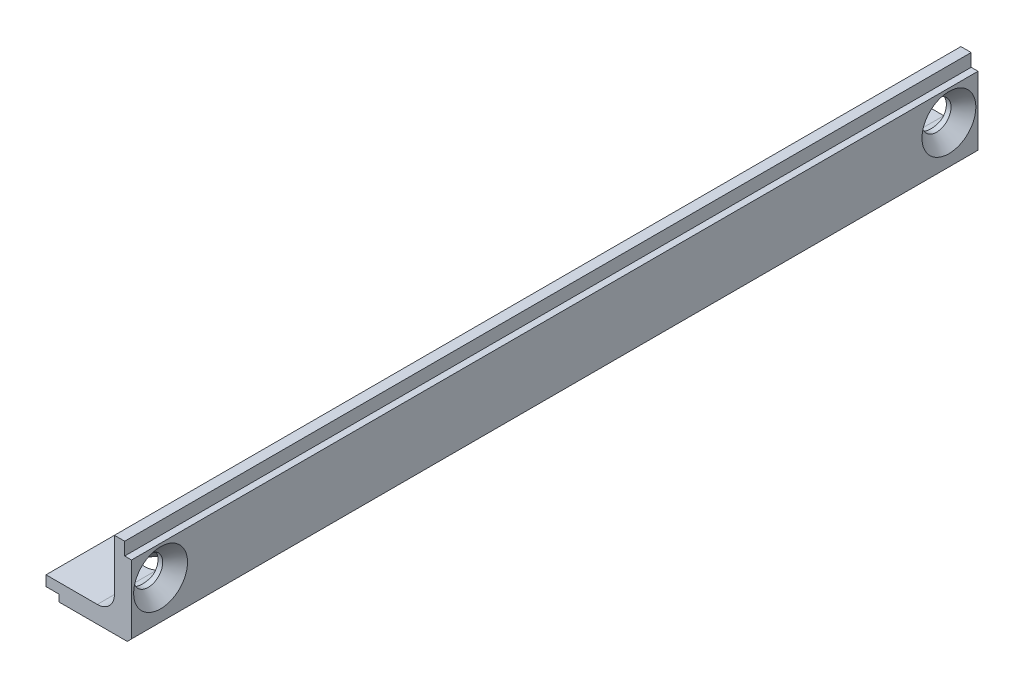
ISO-10303-21;
HEADER;
FILE_DESCRIPTION(('STEP AP214'),'2;1');
FILE_NAME('part.step','',(''),(''),'','','');
FILE_SCHEMA(('AUTOMOTIVE_DESIGN { 1 0 10303 214 1 1 1 1 }'));
ENDSEC;
DATA;
#1=APPLICATION_CONTEXT('core data for automotive mechanical design processes');
#2=APPLICATION_PROTOCOL_DEFINITION('international standard','automotive_design',2000,#1);
#3=PRODUCT_CONTEXT('',#1,'mechanical');
#4=PRODUCT('Part','Part','',(#3));
#5=PRODUCT_RELATED_PRODUCT_CATEGORY('part','',(#4));
#6=PRODUCT_DEFINITION_FORMATION('','',#4);
#7=PRODUCT_DEFINITION_CONTEXT('part definition',#1,'design');
#8=PRODUCT_DEFINITION('design','',#6,#7);
#9=PRODUCT_DEFINITION_SHAPE('','',#8);
#10=(LENGTH_UNIT() NAMED_UNIT(*) SI_UNIT(.MILLI.,.METRE.));
#11=(NAMED_UNIT(*) PLANE_ANGLE_UNIT() SI_UNIT($,.RADIAN.));
#12=(NAMED_UNIT(*) SI_UNIT($,.STERADIAN.) SOLID_ANGLE_UNIT());
#13=UNCERTAINTY_MEASURE_WITH_UNIT(LENGTH_MEASURE(1.E-05),#10,'distance_accuracy_value','');
#14=(GEOMETRIC_REPRESENTATION_CONTEXT(3) GLOBAL_UNCERTAINTY_ASSIGNED_CONTEXT((#13)) GLOBAL_UNIT_ASSIGNED_CONTEXT((#10,
#11,#12)) REPRESENTATION_CONTEXT('',''));
#15=CARTESIAN_POINT('',(0.,0.,0.));
#16=DIRECTION('',(0.,0.,1.));
#17=DIRECTION('',(1.,0.,0.));
#18=AXIS2_PLACEMENT_3D('',#15,#16,#17);
#19=CARTESIAN_POINT('',(0.,1.,99.));
#20=DIRECTION('',(0.,-1.,0.));
#21=DIRECTION('',(0.,0.,-1.));
#22=AXIS2_PLACEMENT_3D('',#19,#20,#21);
#23=PLANE('',#22);
#24=DIRECTION('',(0.,0.,-1.));
#25=VECTOR('',#24,1.);
#26=CARTESIAN_POINT('',(-3.,1.,0.));
#27=LINE('',#26,#25);
#28=CARTESIAN_POINT('',(-3.,1.,99.));
#29=VERTEX_POINT('',#28);
#30=CARTESIAN_POINT('',(-3.,1.,92.0747727084867));
#31=VERTEX_POINT('',#30);
#32=EDGE_CURVE('E174',#29,#31,#27,.T.);
#33=ORIENTED_EDGE('',*,*,#32,.T.);
#34=CARTESIAN_POINT('',(-4.,1.,90.7));
#35=DIRECTION('',(0.,-1.,0.));
#36=DIRECTION('',(0.,0.,-1.));
#37=AXIS2_PLACEMENT_3D('',#34,#35,#36);
#38=CIRCLE('',#37,1.7);
#39=CARTESIAN_POINT('',(-3.,1.,89.3252272915133));
#40=VERTEX_POINT('',#39);
#41=EDGE_CURVE('E67',#31,#40,#38,.T.);
#42=ORIENTED_EDGE('',*,*,#41,.T.);
#43=CARTESIAN_POINT('',(-3.,1.,9.67477270848675));
#44=VERTEX_POINT('',#43);
#45=EDGE_CURVE('E178',#40,#44,#27,.T.);
#46=ORIENTED_EDGE('',*,*,#45,.T.);
#47=CARTESIAN_POINT('',(-4.,1.,8.30000000000001));
#48=DIRECTION('',(0.,-1.,0.));
#49=DIRECTION('',(0.,0.,-1.));
#50=AXIS2_PLACEMENT_3D('',#47,#48,#49);
#51=CIRCLE('',#50,1.7);
#52=CARTESIAN_POINT('',(-3.,1.,6.92522729151325));
#53=VERTEX_POINT('',#52);
#54=EDGE_CURVE('E335',#44,#53,#51,.T.);
#55=ORIENTED_EDGE('',*,*,#54,.T.);
#56=CARTESIAN_POINT('',(-3.,1.,0.));
#57=VERTEX_POINT('',#56);
#58=EDGE_CURVE('E180',#53,#57,#27,.T.);
#59=ORIENTED_EDGE('',*,*,#58,.T.);
#60=DIRECTION('',(-1.,0.,0.));
#61=VECTOR('',#60,1.);
#62=CARTESIAN_POINT('',(0.,1.,0.));
#63=LINE('',#62,#61);
#64=CARTESIAN_POINT('',(-9.,1.,0.));
#65=VERTEX_POINT('',#64);
#66=EDGE_CURVE('E301',#57,#65,#63,.T.);
#67=ORIENTED_EDGE('',*,*,#66,.T.);
#68=DIRECTION('',(0.,0.,-1.));
#69=VECTOR('',#68,1.);
#70=CARTESIAN_POINT('',(-9.,1.,99.));
#71=LINE('',#70,#69);
#72=CARTESIAN_POINT('',(-9.,1.,99.));
#73=VERTEX_POINT('',#72);
#74=EDGE_CURVE('E282',#73,#65,#71,.T.);
#75=ORIENTED_EDGE('',*,*,#74,.F.);
#76=DIRECTION('',(-1.,0.,0.));
#77=VECTOR('',#76,1.);
#78=CARTESIAN_POINT('',(0.,1.,99.));
#79=LINE('',#78,#77);
#80=EDGE_CURVE('E290',#29,#73,#79,.T.);
#81=ORIENTED_EDGE('',*,*,#80,.F.);
#82=EDGE_LOOP('',(#33,#42,#46,#55,#59,#67,#75,#81));
#83=FACE_BOUND('',#82,.T.);
#84=ADVANCED_FACE('F41',(#83),#23,.F.);
#85=CARTESIAN_POINT('',(-9.,-1.,99.));
#86=DIRECTION('',(-1.,0.,0.));
#87=DIRECTION('',(0.,0.,1.));
#88=AXIS2_PLACEMENT_3D('',#85,#86,#87);
#89=PLANE('',#88);
#90=DIRECTION('',(0.,0.,1.));
#91=VECTOR('',#90,1.);
#92=CARTESIAN_POINT('',(-9.,-0.2,0.));
#93=LINE('',#92,#91);
#94=CARTESIAN_POINT('',(-9.,-0.2,0.));
#95=VERTEX_POINT('',#94);
#96=CARTESIAN_POINT('',(-9.,-0.2,99.));
#97=VERTEX_POINT('',#96);
#98=EDGE_CURVE('E304',#95,#97,#93,.T.);
#99=ORIENTED_EDGE('',*,*,#98,.T.);
#100=DIRECTION('',(0.,1.,0.));
#101=VECTOR('',#100,1.);
#102=CARTESIAN_POINT('',(-9.,-1.,99.));
#103=LINE('',#102,#101);
#104=EDGE_CURVE('E314',#97,#73,#103,.T.);
#105=ORIENTED_EDGE('',*,*,#104,.T.);
#106=ORIENTED_EDGE('',*,*,#74,.T.);
#107=DIRECTION('',(0.,1.,0.));
#108=VECTOR('',#107,1.);
#109=CARTESIAN_POINT('',(-9.,-1.,0.));
#110=LINE('',#109,#108);
#111=EDGE_CURVE('E299',#95,#65,#110,.T.);
#112=ORIENTED_EDGE('',*,*,#111,.F.);
#113=EDGE_LOOP('',(#99,#105,#106,#112));
#114=FACE_BOUND('',#113,.T.);
#115=ADVANCED_FACE('F250',(#114),#89,.T.);
#116=CARTESIAN_POINT('',(0.,-1.,99.));
#117=DIRECTION('',(0.,-1.,0.));
#118=DIRECTION('',(0.,0.,-1.));
#119=AXIS2_PLACEMENT_3D('',#116,#117,#118);
#120=PLANE('',#119);
#121=CARTESIAN_POINT('',(-4.,-1.,90.7));
#122=DIRECTION('',(0.,-1.,0.));
#123=DIRECTION('',(0.,0.,-1.));
#124=AXIS2_PLACEMENT_3D('',#121,#122,#123);
#125=CIRCLE('',#124,3.15);
#126=CARTESIAN_POINT('',(-4.,-1.,87.55));
#127=VERTEX_POINT('',#126);
#128=EDGE_CURVE('E168',#127,#127,#125,.T.);
#129=ORIENTED_EDGE('',*,*,#128,.F.);
#130=EDGE_LOOP('',(#129));
#131=FACE_BOUND('',#130,.T.);
#132=CARTESIAN_POINT('',(-4.,-1.,8.30000000000001));
#133=DIRECTION('',(0.,-1.,0.));
#134=DIRECTION('',(0.,0.,-1.));
#135=AXIS2_PLACEMENT_3D('',#132,#133,#134);
#136=CIRCLE('',#135,3.15);
#137=CARTESIAN_POINT('',(-4.,-1.,5.15000000000001));
#138=VERTEX_POINT('',#137);
#139=EDGE_CURVE('E359',#138,#138,#136,.T.);
#140=ORIENTED_EDGE('',*,*,#139,.F.);
#141=EDGE_LOOP('',(#140));
#142=FACE_BOUND('',#141,.T.);
#143=DIRECTION('',(0.,0.,1.));
#144=VECTOR('',#143,1.);
#145=CARTESIAN_POINT('',(-7.5,-1.,0.));
#146=LINE('',#145,#144);
#147=CARTESIAN_POINT('',(-7.5,-1.,0.));
#148=VERTEX_POINT('',#147);
#149=CARTESIAN_POINT('',(-7.5,-1.,99.));
#150=VERTEX_POINT('',#149);
#151=EDGE_CURVE('E338',#148,#150,#146,.T.);
#152=ORIENTED_EDGE('',*,*,#151,.F.);
#153=DIRECTION('',(-1.,0.,0.));
#154=VECTOR('',#153,1.);
#155=CARTESIAN_POINT('',(0.,-1.,0.));
#156=LINE('',#155,#154);
#157=CARTESIAN_POINT('',(0.5,-1.,0.));
#158=VERTEX_POINT('',#157);
#159=EDGE_CURVE('E296',#158,#148,#156,.T.);
#160=ORIENTED_EDGE('',*,*,#159,.F.);
#161=DIRECTION('',(0.,0.,1.));
#162=VECTOR('',#161,1.);
#163=CARTESIAN_POINT('',(0.5,-1.,99.));
#164=LINE('',#163,#162);
#165=CARTESIAN_POINT('',(0.5,-1.,99.));
#166=VERTEX_POINT('',#165);
#167=EDGE_CURVE('E271',#158,#166,#164,.T.);
#168=ORIENTED_EDGE('',*,*,#167,.T.);
#169=DIRECTION('',(-1.,0.,0.));
#170=VECTOR('',#169,1.);
#171=CARTESIAN_POINT('',(0.,-1.,99.));
#172=LINE('',#171,#170);
#173=EDGE_CURVE('E311',#166,#150,#172,.T.);
#174=ORIENTED_EDGE('',*,*,#173,.T.);
#175=EDGE_LOOP('',(#152,#160,#168,#174));
#176=FACE_BOUND('',#175,.T.);
#177=ADVANCED_FACE('F246',(#131,#142,#176),#120,.T.);
#178=CARTESIAN_POINT('',(1.,9.,99.));
#179=DIRECTION('',(1.,0.,0.));
#180=DIRECTION('',(0.,0.,-1.));
#181=AXIS2_PLACEMENT_3D('',#178,#179,#180);
#182=PLANE('',#181);
#183=CARTESIAN_POINT('',(1.,3.99999999999981,95.6));
#184=DIRECTION('',(1.,0.,0.));
#185=DIRECTION('',(0.,0.,-1.));
#186=AXIS2_PLACEMENT_3D('',#183,#184,#185);
#187=CIRCLE('',#186,3.15);
#188=CARTESIAN_POINT('',(1.,3.99999999999981,92.45));
#189=VERTEX_POINT('',#188);
#190=EDGE_CURVE('E378',#189,#189,#187,.T.);
#191=ORIENTED_EDGE('',*,*,#190,.F.);
#192=EDGE_LOOP('',(#191));
#193=FACE_BOUND('',#192,.T.);
#194=CARTESIAN_POINT('',(1.,3.99999999999981,3.40000000000001));
#195=DIRECTION('',(1.,0.,0.));
#196=DIRECTION('',(0.,0.,-1.));
#197=AXIS2_PLACEMENT_3D('',#194,#195,#196);
#198=CIRCLE('',#197,3.15);
#199=CARTESIAN_POINT('',(1.,3.99999999999981,0.250000000000007));
#200=VERTEX_POINT('',#199);
#201=EDGE_CURVE('E367',#200,#200,#198,.T.);
#202=ORIENTED_EDGE('',*,*,#201,.F.);
#203=EDGE_LOOP('',(#202));
#204=FACE_BOUND('',#203,.T.);
#205=DIRECTION('',(0.,0.,1.));
#206=VECTOR('',#205,1.);
#207=CARTESIAN_POINT('',(1.,7.5,0.));
#208=LINE('',#207,#206);
#209=CARTESIAN_POINT('',(1.,7.5,0.));
#210=VERTEX_POINT('',#209);
#211=CARTESIAN_POINT('',(1.,7.5,99.));
#212=VERTEX_POINT('',#211);
#213=EDGE_CURVE('E331',#210,#212,#208,.T.);
#214=ORIENTED_EDGE('',*,*,#213,.T.);
#215=DIRECTION('',(0.,1.,0.));
#216=VECTOR('',#215,1.);
#217=CARTESIAN_POINT('',(1.,9.,99.));
#218=LINE('',#217,#216);
#219=CARTESIAN_POINT('',(1.,-0.500000000000013,99.));
#220=VERTEX_POINT('',#219);
#221=EDGE_CURVE('E309',#212,#220,#218,.F.);
#222=ORIENTED_EDGE('',*,*,#221,.T.);
#223=DIRECTION('',(0.,0.,-1.));
#224=VECTOR('',#223,1.);
#225=CARTESIAN_POINT('',(1.,-0.500000000000013,99.));
#226=LINE('',#225,#224);
#227=CARTESIAN_POINT('',(1.,-0.500000000000013,0.));
#228=VERTEX_POINT('',#227);
#229=EDGE_CURVE('E273',#220,#228,#226,.T.);
#230=ORIENTED_EDGE('',*,*,#229,.T.);
#231=DIRECTION('',(0.,1.,0.));
#232=VECTOR('',#231,1.);
#233=CARTESIAN_POINT('',(1.,9.,0.));
#234=LINE('',#233,#232);
#235=EDGE_CURVE('E294',#210,#228,#234,.F.);
#236=ORIENTED_EDGE('',*,*,#235,.F.);
#237=EDGE_LOOP('',(#214,#222,#230,#236));
#238=FACE_BOUND('',#237,.T.);
#239=ADVANCED_FACE('F242',(#193,#204,#238),#182,.T.);
#240=CARTESIAN_POINT('',(-1.,9.,99.));
#241=DIRECTION('',(0.,1.,0.));
#242=DIRECTION('',(0.,0.,1.));
#243=AXIS2_PLACEMENT_3D('',#240,#241,#242);
#244=PLANE('',#243);
#245=DIRECTION('',(0.,0.,1.));
#246=VECTOR('',#245,1.);
#247=CARTESIAN_POINT('',(0.2,9.,0.));
#248=LINE('',#247,#246);
#249=CARTESIAN_POINT('',(0.2,9.,0.));
#250=VERTEX_POINT('',#249);
#251=CARTESIAN_POINT('',(0.2,9.,99.));
#252=VERTEX_POINT('',#251);
#253=EDGE_CURVE('E325',#250,#252,#248,.T.);
#254=ORIENTED_EDGE('',*,*,#253,.F.);
#255=DIRECTION('',(1.,0.,0.));
#256=VECTOR('',#255,1.);
#257=CARTESIAN_POINT('',(-1.,9.,0.));
#258=LINE('',#257,#256);
#259=CARTESIAN_POINT('',(-1.,9.,0.));
#260=VERTEX_POINT('',#259);
#261=EDGE_CURVE('E291',#260,#250,#258,.T.);
#262=ORIENTED_EDGE('',*,*,#261,.F.);
#263=DIRECTION('',(0.,0.,-1.));
#264=VECTOR('',#263,1.);
#265=CARTESIAN_POINT('',(-1.,9.,99.));
#266=LINE('',#265,#264);
#267=CARTESIAN_POINT('',(-1.,9.,99.));
#268=VERTEX_POINT('',#267);
#269=EDGE_CURVE('E285',#268,#260,#266,.T.);
#270=ORIENTED_EDGE('',*,*,#269,.F.);
#271=DIRECTION('',(1.,0.,0.));
#272=VECTOR('',#271,1.);
#273=CARTESIAN_POINT('',(-1.,9.,99.));
#274=LINE('',#273,#272);
#275=EDGE_CURVE('E306',#268,#252,#274,.T.);
#276=ORIENTED_EDGE('',*,*,#275,.T.);
#277=EDGE_LOOP('',(#254,#262,#270,#276));
#278=FACE_BOUND('',#277,.T.);
#279=ADVANCED_FACE('F239',(#278),#244,.T.);
#280=CARTESIAN_POINT('',(-1.,9.,99.));
#281=DIRECTION('',(1.,0.,0.));
#282=DIRECTION('',(0.,0.,-1.));
#283=AXIS2_PLACEMENT_3D('',#280,#281,#282);
#284=PLANE('',#283);
#285=DIRECTION('',(0.,0.,-1.));
#286=VECTOR('',#285,1.);
#287=CARTESIAN_POINT('',(-1.,3.,99.));
#288=LINE('',#287,#286);
#289=CARTESIAN_POINT('',(-1.,3.,4.77477270848689));
#290=VERTEX_POINT('',#289);
#291=CARTESIAN_POINT('',(-1.,3.,94.2252272915131));
#292=VERTEX_POINT('',#291);
#293=EDGE_CURVE('E167',#290,#292,#288,.F.);
#294=ORIENTED_EDGE('',*,*,#293,.T.);
#295=CARTESIAN_POINT('',(-1.,3.99999999999981,95.6));
#296=DIRECTION('',(1.,0.,0.));
#297=DIRECTION('',(0.,0.,-1.));
#298=AXIS2_PLACEMENT_3D('',#295,#296,#297);
#299=CIRCLE('',#298,1.7);
#300=CARTESIAN_POINT('',(-1.,3.,96.9747727084869));
#301=VERTEX_POINT('',#300);
#302=EDGE_CURVE('E61',#292,#301,#299,.T.);
#303=ORIENTED_EDGE('',*,*,#302,.T.);
#304=CARTESIAN_POINT('',(-1.,3.,99.));
#305=VERTEX_POINT('',#304);
#306=EDGE_CURVE('E164',#301,#305,#288,.F.);
#307=ORIENTED_EDGE('',*,*,#306,.T.);
#308=DIRECTION('',(0.,1.,0.));
#309=VECTOR('',#308,1.);
#310=CARTESIAN_POINT('',(-1.,9.,99.));
#311=LINE('',#310,#309);
#312=EDGE_CURVE('E287',#268,#305,#311,.F.);
#313=ORIENTED_EDGE('',*,*,#312,.F.);
#314=ORIENTED_EDGE('',*,*,#269,.T.);
#315=DIRECTION('',(0.,1.,0.));
#316=VECTOR('',#315,1.);
#317=CARTESIAN_POINT('',(-1.,9.,0.));
#318=LINE('',#317,#316);
#319=CARTESIAN_POINT('',(-1.,3.,0.));
#320=VERTEX_POINT('',#319);
#321=EDGE_CURVE('E288',#260,#320,#318,.F.);
#322=ORIENTED_EDGE('',*,*,#321,.T.);
#323=CARTESIAN_POINT('',(-1.,3.,2.02522729151311));
#324=VERTEX_POINT('',#323);
#325=EDGE_CURVE('E176',#320,#324,#288,.F.);
#326=ORIENTED_EDGE('',*,*,#325,.T.);
#327=CARTESIAN_POINT('',(-1.,3.99999999999981,3.40000000000001));
#328=DIRECTION('',(1.,0.,0.));
#329=DIRECTION('',(0.,0.,-1.));
#330=AXIS2_PLACEMENT_3D('',#327,#328,#329);
#331=CIRCLE('',#330,1.7);
#332=EDGE_CURVE('E362',#324,#290,#331,.T.);
#333=ORIENTED_EDGE('',*,*,#332,.T.);
#334=EDGE_LOOP('',(#294,#303,#307,#313,#314,#322,#326,#333));
#335=FACE_BOUND('',#334,.T.);
#336=ADVANCED_FACE('F162',(#335),#284,.F.);
#337=CARTESIAN_POINT('',(0.,0.,99.));
#338=DIRECTION('',(0.,0.,-1.));
#339=DIRECTION('',(0.,-1.,0.));
#340=AXIS2_PLACEMENT_3D('',#337,#338,#339);
#341=PLANE('',#340);
#342=ORIENTED_EDGE('',*,*,#104,.F.);
#343=DIRECTION('',(-1.,0.,0.));
#344=VECTOR('',#343,1.);
#345=CARTESIAN_POINT('',(-9.,-0.2,99.));
#346=LINE('',#345,#344);
#347=CARTESIAN_POINT('',(-7.5,-0.2,99.));
#348=VERTEX_POINT('',#347);
#349=EDGE_CURVE('E345',#348,#97,#346,.T.);
#350=ORIENTED_EDGE('',*,*,#349,.F.);
#351=DIRECTION('',(0.,1.,0.));
#352=VECTOR('',#351,1.);
#353=CARTESIAN_POINT('',(-7.5,-1.,99.));
#354=LINE('',#353,#352);
#355=EDGE_CURVE('E329',#150,#348,#354,.T.);
#356=ORIENTED_EDGE('',*,*,#355,.F.);
#357=ORIENTED_EDGE('',*,*,#173,.F.);
#358=DIRECTION('',(-0.707106781186557,-0.707106781186538,0.));
#359=VECTOR('',#358,1.);
#360=CARTESIAN_POINT('',(1.,-0.500000000000013,99.));
#361=LINE('',#360,#359);
#362=EDGE_CURVE('E269',#166,#220,#361,.F.);
#363=ORIENTED_EDGE('',*,*,#362,.T.);
#364=ORIENTED_EDGE('',*,*,#221,.F.);
#365=DIRECTION('',(1.,0.,0.));
#366=VECTOR('',#365,1.);
#367=CARTESIAN_POINT('',(1.,7.5,99.));
#368=LINE('',#367,#366);
#369=CARTESIAN_POINT('',(0.2,7.5,99.));
#370=VERTEX_POINT('',#369);
#371=EDGE_CURVE('E321',#370,#212,#368,.T.);
#372=ORIENTED_EDGE('',*,*,#371,.F.);
#373=DIRECTION('',(0.,-1.,0.));
#374=VECTOR('',#373,1.);
#375=CARTESIAN_POINT('',(0.2,9.,99.));
#376=LINE('',#375,#374);
#377=EDGE_CURVE('E326',#252,#370,#376,.T.);
#378=ORIENTED_EDGE('',*,*,#377,.F.);
#379=ORIENTED_EDGE('',*,*,#275,.F.);
#380=ORIENTED_EDGE('',*,*,#312,.T.);
#381=CARTESIAN_POINT('',(-3.,3.,99.));
#382=DIRECTION('',(0.,0.,-1.));
#383=DIRECTION('',(-1.,0.,0.));
#384=AXIS2_PLACEMENT_3D('',#381,#382,#383);
#385=CIRCLE('',#384,2.);
#386=EDGE_CURVE('E173',#305,#29,#385,.T.);
#387=ORIENTED_EDGE('',*,*,#386,.T.);
#388=ORIENTED_EDGE('',*,*,#80,.T.);
#389=EDGE_LOOP('',(#342,#350,#356,#357,#363,#364,#372,#378,#379,#380,#387,#388));
#390=FACE_BOUND('',#389,.T.);
#391=ADVANCED_FACE('F229',(#390),#341,.F.);
#392=CARTESIAN_POINT('',(0.,0.,0.));
#393=DIRECTION('',(0.,0.,-1.));
#394=DIRECTION('',(0.,-1.,0.));
#395=AXIS2_PLACEMENT_3D('',#392,#393,#394);
#396=PLANE('',#395);
#397=DIRECTION('',(-1.,0.,0.));
#398=VECTOR('',#397,1.);
#399=CARTESIAN_POINT('',(-9.,-0.2,0.));
#400=LINE('',#399,#398);
#401=CARTESIAN_POINT('',(-7.5,-0.2,0.));
#402=VERTEX_POINT('',#401);
#403=EDGE_CURVE('E341',#402,#95,#400,.T.);
#404=ORIENTED_EDGE('',*,*,#403,.T.);
#405=ORIENTED_EDGE('',*,*,#111,.T.);
#406=ORIENTED_EDGE('',*,*,#66,.F.);
#407=CARTESIAN_POINT('',(-3.,3.,0.));
#408=DIRECTION('',(0.,0.,-1.));
#409=DIRECTION('',(-1.,0.,0.));
#410=AXIS2_PLACEMENT_3D('',#407,#408,#409);
#411=CIRCLE('',#410,2.);
#412=EDGE_CURVE('E183',#57,#320,#411,.F.);
#413=ORIENTED_EDGE('',*,*,#412,.T.);
#414=ORIENTED_EDGE('',*,*,#321,.F.);
#415=ORIENTED_EDGE('',*,*,#261,.T.);
#416=DIRECTION('',(0.,-1.,0.));
#417=VECTOR('',#416,1.);
#418=CARTESIAN_POINT('',(0.2,9.,0.));
#419=LINE('',#418,#417);
#420=CARTESIAN_POINT('',(0.2,7.5,0.));
#421=VERTEX_POINT('',#420);
#422=EDGE_CURVE('E318',#250,#421,#419,.T.);
#423=ORIENTED_EDGE('',*,*,#422,.T.);
#424=DIRECTION('',(1.,0.,0.));
#425=VECTOR('',#424,1.);
#426=CARTESIAN_POINT('',(1.,7.5,0.));
#427=LINE('',#426,#425);
#428=EDGE_CURVE('E322',#421,#210,#427,.T.);
#429=ORIENTED_EDGE('',*,*,#428,.T.);
#430=ORIENTED_EDGE('',*,*,#235,.T.);
#431=DIRECTION('',(0.707106781186557,0.707106781186538,0.));
#432=VECTOR('',#431,1.);
#433=CARTESIAN_POINT('',(0.749999999999993,-0.750000000000013,0.));
#434=LINE('',#433,#432);
#435=EDGE_CURVE('E277',#228,#158,#434,.F.);
#436=ORIENTED_EDGE('',*,*,#435,.T.);
#437=ORIENTED_EDGE('',*,*,#159,.T.);
#438=DIRECTION('',(0.,1.,0.));
#439=VECTOR('',#438,1.);
#440=CARTESIAN_POINT('',(-7.5,-1.,0.));
#441=LINE('',#440,#439);
#442=EDGE_CURVE('E347',#148,#402,#441,.T.);
#443=ORIENTED_EDGE('',*,*,#442,.T.);
#444=EDGE_LOOP('',(#404,#405,#406,#413,#414,#415,#423,#429,#430,#436,#437,#443));
#445=FACE_BOUND('',#444,.T.);
#446=ADVANCED_FACE('F232',(#445),#396,.T.);
#447=CARTESIAN_POINT('',(1.,-0.500000000000013,99.));
#448=DIRECTION('',(-0.707106781186538,0.707106781186557,0.));
#449=DIRECTION('',(0.,0.,-1.));
#450=AXIS2_PLACEMENT_3D('',#447,#448,#449);
#451=PLANE('',#450);
#452=ORIENTED_EDGE('',*,*,#362,.F.);
#453=ORIENTED_EDGE('',*,*,#167,.F.);
#454=ORIENTED_EDGE('',*,*,#435,.F.);
#455=ORIENTED_EDGE('',*,*,#229,.F.);
#456=EDGE_LOOP('',(#452,#453,#454,#455));
#457=FACE_BOUND('',#456,.T.);
#458=ADVANCED_FACE('F236',(#457),#451,.F.);
#459=CARTESIAN_POINT('',(-3.,3.,99.));
#460=DIRECTION('',(0.,0.,1.));
#461=DIRECTION('',(1.,0.,0.));
#462=AXIS2_PLACEMENT_3D('',#459,#460,#461);
#463=CYLINDRICAL_SURFACE('',#462,2.);
#464=ORIENTED_EDGE('',*,*,#306,.F.);
#465=CARTESIAN_POINT('',(-1.,3.,96.9747727084869));
#466=CARTESIAN_POINT('',(-0.999998681447815,2.96212379837325,96.9472249032567));
#467=CARTESIAN_POINT('',(-1.00107593638405,2.92542111891677,96.9181303536666));
#468=CARTESIAN_POINT('',(-1.00497661061265,2.85461582305832,96.8570908065022));
#469=CARTESIAN_POINT('',(-1.00779861317024,2.82051112230964,96.8251481395899));
#470=CARTESIAN_POINT('',(-1.01824886728311,2.72257567142991,96.7255364981819));
#471=CARTESIAN_POINT('',(-1.02786619204256,2.66289854888449,96.6539194701062));
#472=CARTESIAN_POINT('',(-1.0490839377359,2.55628157594192,96.5023629198458));
#473=CARTESIAN_POINT('',(-1.06067985450192,2.50931340871032,96.4224424581632));
#474=CARTESIAN_POINT('',(-1.0828205416929,2.42889056064065,96.2558690996959));
#475=CARTESIAN_POINT('',(-1.09336490040887,2.39544115718278,96.1692135894288));
#476=CARTESIAN_POINT('',(-1.111099624438,2.34205635512498,95.9879117739126));
#477=CARTESIAN_POINT('',(-1.11815048151495,2.32267053831034,95.8930880733731));
#478=CARTESIAN_POINT('',(-1.12635496818594,2.30028165204857,95.701307802256));
#479=CARTESIAN_POINT('',(-1.12751256601525,2.2972675585845,95.6043527110444));
#480=CARTESIAN_POINT('',(-1.1237432646249,2.307412203359,95.4172309434282));
#481=CARTESIAN_POINT('',(-1.11917384977096,2.31962051220347,95.3270032467441));
#482=CARTESIAN_POINT('',(-1.10567954867382,2.35815857632059,95.1499143068444));
#483=CARTESIAN_POINT('',(-1.09675154840002,2.38449842933579,95.0630555185416));
#484=CARTESIAN_POINT('',(-1.07650988000463,2.45099653986633,94.8935982091963));
#485=CARTESIAN_POINT('',(-1.0651623557025,2.49135663892949,94.8110833947961));
#486=CARTESIAN_POINT('',(-1.04298185685301,2.58481516020775,94.6536273875122));
#487=CARTESIAN_POINT('',(-1.03214833816533,2.63789973444661,94.5786780862745));
#488=CARTESIAN_POINT('',(-1.01631391741333,2.74115838189871,94.4554092711853));
#489=CARTESIAN_POINT('',(-1.01053355067507,2.78882465587956,94.4050794696318));
#490=CARTESIAN_POINT('',(-1.00237216617597,2.89011585943688,94.3104320705811));
#491=CARTESIAN_POINT('',(-0.999994163807238,2.94374602929553,94.266119837672));
#492=CARTESIAN_POINT('',(-1.,3.,94.2252272915131));
#493=B_SPLINE_CURVE_WITH_KNOTS('',3,(#465,#466,#467,#468,#469,#470,#471,#472,#473,#474,#475,
#476,#477,#478,#479,#480,#481,#482,#483,#484,#485,#486,#487,#488,#489,#490,#491,#492),
.UNSPECIFIED.,.F.,.F.,(4,2,2,2,2,2,2,2,2,2,2,2,2,4),(0.,0.140383951004699,0.280654059704483,
0.560369780512122,0.839457036305561,1.11865313564797,1.4082453119307,1.69764246505571,
1.9698421442157,2.24223658412901,2.51872722708374,2.79491832214426,3.00303187974697,
3.21132976683755),.UNSPECIFIED.);
#494=EDGE_CURVE('E11',#301,#292,#493,.T.);
#495=ORIENTED_EDGE('',*,*,#494,.T.);
#496=ORIENTED_EDGE('',*,*,#293,.F.);
#497=CARTESIAN_POINT('',(-1.,3.,4.77477270848689));
#498=CARTESIAN_POINT('',(-0.999998681447815,2.96212379837324,4.7472249032567));
#499=CARTESIAN_POINT('',(-1.00107593638405,2.92542111891677,4.71813035366658));
#500=CARTESIAN_POINT('',(-1.00497661061265,2.85461582305831,4.65709080650217));
#501=CARTESIAN_POINT('',(-1.00779861317024,2.82051112230964,4.62514813958988));
#502=CARTESIAN_POINT('',(-1.01824886728311,2.72257567142991,4.52553649818191));
#503=CARTESIAN_POINT('',(-1.02786619204256,2.66289854888449,4.45391947010623));
#504=CARTESIAN_POINT('',(-1.0490839377359,2.55628157594192,4.3023629198458));
#505=CARTESIAN_POINT('',(-1.06067985450192,2.50931340871032,4.22244245816321));
#506=CARTESIAN_POINT('',(-1.0828205416929,2.42889056064064,4.05586909969588));
#507=CARTESIAN_POINT('',(-1.09336490040887,2.39544115718278,3.96921358942885));
#508=CARTESIAN_POINT('',(-1.111099624438,2.34205635512497,3.78791177391256));
#509=CARTESIAN_POINT('',(-1.11815048151495,2.32267053831034,3.69308807337314));
#510=CARTESIAN_POINT('',(-1.12635496818594,2.30028165204857,3.50130780225599));
#511=CARTESIAN_POINT('',(-1.12751256601525,2.2972675585845,3.40435271104443));
#512=CARTESIAN_POINT('',(-1.1237432646249,2.30741220335899,3.21723094342822));
#513=CARTESIAN_POINT('',(-1.11917384977096,2.31962051220347,3.12700324674413));
#514=CARTESIAN_POINT('',(-1.10567954867382,2.35815857632059,2.9499143068444));
#515=CARTESIAN_POINT('',(-1.09675154840002,2.38449842933578,2.86305551854159));
#516=CARTESIAN_POINT('',(-1.07650988000463,2.45099653986633,2.69359820919629));
#517=CARTESIAN_POINT('',(-1.0651623557025,2.49135663892948,2.61108339479616));
#518=CARTESIAN_POINT('',(-1.04298185685301,2.58481516020775,2.45362738751225));
#519=CARTESIAN_POINT('',(-1.03214833816533,2.63789973444661,2.37867808627447));
#520=CARTESIAN_POINT('',(-1.01631391741333,2.74115838189871,2.25540927118531));
#521=CARTESIAN_POINT('',(-1.01053355067507,2.78882465587956,2.20507946963177));
#522=CARTESIAN_POINT('',(-1.00237216617597,2.89011585943687,2.11043207058108));
#523=CARTESIAN_POINT('',(-0.999994163807237,2.94374602929552,2.06611983767204));
#524=CARTESIAN_POINT('',(-1.,3.,2.02522729151311));
#525=B_SPLINE_CURVE_WITH_KNOTS('',3,(#497,#498,#499,#500,#501,#502,#503,#504,#505,#506,#507,
#508,#509,#510,#511,#512,#513,#514,#515,#516,#517,#518,#519,#520,#521,#522,#523,#524),
.UNSPECIFIED.,.F.,.F.,(4,2,2,2,2,2,2,2,2,2,2,2,2,4),(0.,0.140383951004703,0.280654059704475,
0.560369780512119,0.839457036305569,1.11865313564798,1.40824531193072,1.6976424650557,
1.96984214421569,2.242236584129,2.51872722708371,2.79491832214425,3.00303187974693,
3.21132976683754),.UNSPECIFIED.);
#526=EDGE_CURVE('E200',#290,#324,#525,.T.);
#527=ORIENTED_EDGE('',*,*,#526,.T.);
#528=ORIENTED_EDGE('',*,*,#325,.F.);
#529=ORIENTED_EDGE('',*,*,#412,.F.);
#530=ORIENTED_EDGE('',*,*,#58,.F.);
#531=CARTESIAN_POINT('',(-3.,1.,6.92522729151325));
#532=CARTESIAN_POINT('',(-2.96212379837325,0.999998681447815,6.95277509674345));
#533=CARTESIAN_POINT('',(-2.92542111891678,1.00107593638405,6.98186964633358));
#534=CARTESIAN_POINT('',(-2.85461582305834,1.00497661061265,7.04290919349801));
#535=CARTESIAN_POINT('',(-2.82051112230966,1.00779861317024,7.07485186041029));
#536=CARTESIAN_POINT('',(-2.72257567142994,1.01824886728311,7.17446350181828));
#537=CARTESIAN_POINT('',(-2.66289854888453,1.02786619204256,7.24608052989397));
#538=CARTESIAN_POINT('',(-2.55628157594198,1.04908393773589,7.39763708015443));
#539=CARTESIAN_POINT('',(-2.50931340871039,1.0606798545019,7.47755754183702));
#540=CARTESIAN_POINT('',(-2.42889056064074,1.08282054169287,7.64413090030437));
#541=CARTESIAN_POINT('',(-2.39544115718289,1.09336490040884,7.73078641057141));
#542=CARTESIAN_POINT('',(-2.34205635512511,1.11109962443795,7.9120882260877));
#543=CARTESIAN_POINT('',(-2.32267053831049,1.1181504815149,8.00691192662713));
#544=CARTESIAN_POINT('',(-2.30028165204875,1.12635496818587,8.19869219774427));
#545=CARTESIAN_POINT('',(-2.29726755858469,1.12751256601518,8.29564728895584));
#546=CARTESIAN_POINT('',(-2.30741220335922,1.12374326462481,8.48276905657204));
#547=CARTESIAN_POINT('',(-2.3196205122037,1.11917384977087,8.57299675325613));
#548=CARTESIAN_POINT('',(-2.35815857632085,1.10567954867373,8.75008569315586));
#549=CARTESIAN_POINT('',(-2.38449842933606,1.09675154839993,8.83694448145867));
#550=CARTESIAN_POINT('',(-2.45099653986663,1.07650988000455,9.00640179080397));
#551=CARTESIAN_POINT('',(-2.4913566389298,1.06516235570241,9.0889166052041));
#552=CARTESIAN_POINT('',(-2.5848151602081,1.04298185685293,9.246372612488));
#553=CARTESIAN_POINT('',(-2.63789973444697,1.03214833816526,9.32132191372578));
#554=CARTESIAN_POINT('',(-2.74115838189904,1.01631391741329,9.44459072881486));
#555=CARTESIAN_POINT('',(-2.78882465587983,1.01053355067505,9.49492053036832));
#556=CARTESIAN_POINT('',(-2.89011585943702,1.00237216617597,9.58956792941889));
#557=CARTESIAN_POINT('',(-2.9437460292956,0.999994163807238,9.63388016232787));
#558=CARTESIAN_POINT('',(-3.,1.,9.67477270848675));
#559=B_SPLINE_CURVE_WITH_KNOTS('',3,(#531,#532,#533,#534,#535,#536,#537,#538,#539,#540,#541,
#542,#543,#544,#545,#546,#547,#548,#549,#550,#551,#552,#553,#554,#555,#556,#557,#558),
.UNSPECIFIED.,.F.,.F.,(4,2,2,2,2,2,2,2,2,2,2,2,2,4),(0.,0.140383951004705,0.280654059704478,
0.560369780512129,0.839457036305585,1.118653135648,1.40824531193074,1.69764246505571,
1.9698421442157,2.24223658412902,2.51872722708375,2.7949183221443,3.00303187974671,
3.21132976683705),.UNSPECIFIED.);
#560=EDGE_CURVE('E190',#53,#44,#559,.T.);
#561=ORIENTED_EDGE('',*,*,#560,.T.);
#562=ORIENTED_EDGE('',*,*,#45,.F.);
#563=CARTESIAN_POINT('',(-3.,1.,89.3252272915133));
#564=CARTESIAN_POINT('',(-2.96212379837325,0.999998681447815,89.3527750967435));
#565=CARTESIAN_POINT('',(-2.92542111891678,1.00107593638405,89.3818696463336));
#566=CARTESIAN_POINT('',(-2.85461582305834,1.00497661061265,89.442909193498));
#567=CARTESIAN_POINT('',(-2.82051112230966,1.00779861317024,89.4748518604103));
#568=CARTESIAN_POINT('',(-2.72257567142994,1.0182488672831,89.5744635018183));
#569=CARTESIAN_POINT('',(-2.66289854888453,1.02786619204256,89.646080529894));
#570=CARTESIAN_POINT('',(-2.55628157594198,1.04908393773589,89.7976370801544));
#571=CARTESIAN_POINT('',(-2.50931340871039,1.0606798545019,89.877557541837));
#572=CARTESIAN_POINT('',(-2.42889056064074,1.08282054169287,90.0441309003044));
#573=CARTESIAN_POINT('',(-2.39544115718289,1.09336490040884,90.1307864105714));
#574=CARTESIAN_POINT('',(-2.34205635512511,1.11109962443795,90.3120882260877));
#575=CARTESIAN_POINT('',(-2.32267053831049,1.1181504815149,90.4069119266271));
#576=CARTESIAN_POINT('',(-2.30028165204875,1.12635496818587,90.5986921977443));
#577=CARTESIAN_POINT('',(-2.29726755858469,1.12751256601518,90.6956472889558));
#578=CARTESIAN_POINT('',(-2.30741220335922,1.12374326462481,90.882769056572));
#579=CARTESIAN_POINT('',(-2.3196205122037,1.11917384977087,90.9729967532561));
#580=CARTESIAN_POINT('',(-2.35815857632084,1.10567954867373,91.1500856931558));
#581=CARTESIAN_POINT('',(-2.38449842933606,1.09675154839993,91.2369444814587));
#582=CARTESIAN_POINT('',(-2.45099653986663,1.07650988000455,91.406401790804));
#583=CARTESIAN_POINT('',(-2.4913566389298,1.06516235570241,91.4889166052041));
#584=CARTESIAN_POINT('',(-2.58481516020809,1.04298185685293,91.646372612488));
#585=CARTESIAN_POINT('',(-2.63789973444697,1.03214833816526,91.7213219137258));
#586=CARTESIAN_POINT('',(-2.74115838189904,1.01631391741329,91.8445907288149));
#587=CARTESIAN_POINT('',(-2.78882465587983,1.01053355067505,91.8949205303683));
#588=CARTESIAN_POINT('',(-2.89011585943702,1.00237216617596,91.9895679294189));
#589=CARTESIAN_POINT('',(-2.9437460292956,0.999994163807237,92.0338801623279));
#590=CARTESIAN_POINT('',(-3.00000000000001,1.,92.0747727084867));
#591=B_SPLINE_CURVE_WITH_KNOTS('',3,(#563,#564,#565,#566,#567,#568,#569,#570,#571,#572,#573,
#574,#575,#576,#577,#578,#579,#580,#581,#582,#583,#584,#585,#586,#587,#588,#589,#590),
.UNSPECIFIED.,.F.,.F.,(4,2,2,2,2,2,2,2,2,2,2,2,2,4),(0.,0.140383951004707,0.280654059704476,
0.560369780512119,0.839457036305579,1.11865313564797,1.40824531193073,1.6976424650557,
1.96984214421569,2.24223658412902,2.51872722708375,2.7949183221443,3.00303187974672,
3.21132976683706),.UNSPECIFIED.);
#592=EDGE_CURVE('E55',#40,#31,#591,.T.);
#593=ORIENTED_EDGE('',*,*,#592,.T.);
#594=ORIENTED_EDGE('',*,*,#32,.F.);
#595=ORIENTED_EDGE('',*,*,#386,.F.);
#596=EDGE_LOOP('',(#464,#495,#496,#527,#528,#529,#530,#561,#562,#593,#594,#595));
#597=FACE_BOUND('',#596,.T.);
#598=ADVANCED_FACE('F43',(#597),#463,.F.);
#599=CARTESIAN_POINT('',(1.,7.5,0.));
#600=DIRECTION('',(0.,-1.,0.));
#601=DIRECTION('',(0.,0.,-1.));
#602=AXIS2_PLACEMENT_3D('',#599,#600,#601);
#603=PLANE('',#602);
#604=ORIENTED_EDGE('',*,*,#371,.T.);
#605=ORIENTED_EDGE('',*,*,#213,.F.);
#606=ORIENTED_EDGE('',*,*,#428,.F.);
#607=DIRECTION('',(0.,0.,1.));
#608=VECTOR('',#607,1.);
#609=CARTESIAN_POINT('',(0.2,7.5,0.));
#610=LINE('',#609,#608);
#611=EDGE_CURVE('E334',#421,#370,#610,.T.);
#612=ORIENTED_EDGE('',*,*,#611,.T.);
#613=EDGE_LOOP('',(#604,#605,#606,#612));
#614=FACE_BOUND('',#613,.T.);
#615=ADVANCED_FACE('F224',(#614),#603,.F.);
#616=CARTESIAN_POINT('',(0.2,9.,0.));
#617=DIRECTION('',(-1.,0.,0.));
#618=DIRECTION('',(0.,-1.,0.));
#619=AXIS2_PLACEMENT_3D('',#616,#617,#618);
#620=PLANE('',#619);
#621=ORIENTED_EDGE('',*,*,#377,.T.);
#622=ORIENTED_EDGE('',*,*,#611,.F.);
#623=ORIENTED_EDGE('',*,*,#422,.F.);
#624=ORIENTED_EDGE('',*,*,#253,.T.);
#625=EDGE_LOOP('',(#621,#622,#623,#624));
#626=FACE_BOUND('',#625,.T.);
#627=ADVANCED_FACE('F217',(#626),#620,.F.);
#628=CARTESIAN_POINT('',(-9.,-0.2,0.));
#629=DIRECTION('',(0.,1.,0.));
#630=DIRECTION('',(0.,0.,1.));
#631=AXIS2_PLACEMENT_3D('',#628,#629,#630);
#632=PLANE('',#631);
#633=ORIENTED_EDGE('',*,*,#349,.T.);
#634=ORIENTED_EDGE('',*,*,#98,.F.);
#635=ORIENTED_EDGE('',*,*,#403,.F.);
#636=DIRECTION('',(0.,0.,1.));
#637=VECTOR('',#636,1.);
#638=CARTESIAN_POINT('',(-7.5,-0.2,0.));
#639=LINE('',#638,#637);
#640=EDGE_CURVE('E340',#402,#348,#639,.T.);
#641=ORIENTED_EDGE('',*,*,#640,.T.);
#642=EDGE_LOOP('',(#633,#634,#635,#641));
#643=FACE_BOUND('',#642,.T.);
#644=ADVANCED_FACE('F214',(#643),#632,.F.);
#645=CARTESIAN_POINT('',(-7.5,-1.,0.));
#646=DIRECTION('',(1.,0.,0.));
#647=DIRECTION('',(0.,0.,-1.));
#648=AXIS2_PLACEMENT_3D('',#645,#646,#647);
#649=PLANE('',#648);
#650=ORIENTED_EDGE('',*,*,#355,.T.);
#651=ORIENTED_EDGE('',*,*,#640,.F.);
#652=ORIENTED_EDGE('',*,*,#442,.F.);
#653=ORIENTED_EDGE('',*,*,#151,.T.);
#654=EDGE_LOOP('',(#650,#651,#652,#653));
#655=FACE_BOUND('',#654,.T.);
#656=ADVANCED_FACE('F212',(#655),#649,.F.);
#657=CARTESIAN_POINT('',(-4.,-1.,8.30000000000001));
#658=DIRECTION('',(0.,-1.,0.));
#659=DIRECTION('',(0.,0.,-1.));
#660=AXIS2_PLACEMENT_3D('',#657,#658,#659);
#661=CYLINDRICAL_SURFACE('',#660,1.7);
#662=CARTESIAN_POINT('',(-4.,0.449999999999999,8.30000000000001));
#663=DIRECTION('',(0.,-1.,0.));
#664=DIRECTION('',(0.,0.,-1.));
#665=AXIS2_PLACEMENT_3D('',#662,#663,#664);
#666=CIRCLE('',#665,1.7);
#667=CARTESIAN_POINT('',(-4.,0.449999999999999,6.60000000000001));
#668=VERTEX_POINT('',#667);
#669=EDGE_CURVE('E356',#668,#668,#666,.T.);
#670=ORIENTED_EDGE('',*,*,#669,.T.);
#671=EDGE_LOOP('',(#670));
#672=FACE_BOUND('',#671,.T.);
#673=ORIENTED_EDGE('',*,*,#560,.F.);
#674=ORIENTED_EDGE('',*,*,#54,.F.);
#675=EDGE_LOOP('',(#673,#674));
#676=FACE_BOUND('',#675,.T.);
#677=ADVANCED_FACE('F206',(#672,#676),#661,.F.);
#678=CARTESIAN_POINT('',(-4.,-1.,8.30000000000001));
#679=DIRECTION('',(0.,-1.,0.));
#680=DIRECTION('',(0.,0.,-1.));
#681=AXIS2_PLACEMENT_3D('',#678,#679,#680);
#682=CONICAL_SURFACE('',#681,3.15,0.785398163397448);
#683=ORIENTED_EDGE('',*,*,#669,.F.);
#684=EDGE_LOOP('',(#683));
#685=FACE_BOUND('',#684,.T.);
#686=ORIENTED_EDGE('',*,*,#139,.T.);
#687=EDGE_LOOP('',(#686));
#688=FACE_BOUND('',#687,.T.);
#689=ADVANCED_FACE('F211',(#685,#688),#682,.F.);
#690=CARTESIAN_POINT('',(1.,3.99999999999981,3.40000000000001));
#691=DIRECTION('',(1.,0.,0.));
#692=DIRECTION('',(0.,0.,-1.));
#693=AXIS2_PLACEMENT_3D('',#690,#691,#692);
#694=CYLINDRICAL_SURFACE('',#693,1.7);
#695=CARTESIAN_POINT('',(-0.449999999999999,3.99999999999981,3.40000000000001));
#696=DIRECTION('',(1.,0.,0.));
#697=DIRECTION('',(0.,0.,-1.));
#698=AXIS2_PLACEMENT_3D('',#695,#696,#697);
#699=CIRCLE('',#698,1.7);
#700=CARTESIAN_POINT('',(-0.449999999999999,3.99999999999981,1.70000000000001));
#701=VERTEX_POINT('',#700);
#702=EDGE_CURVE('E364',#701,#701,#699,.T.);
#703=ORIENTED_EDGE('',*,*,#702,.T.);
#704=EDGE_LOOP('',(#703));
#705=FACE_BOUND('',#704,.T.);
#706=ORIENTED_EDGE('',*,*,#526,.F.);
#707=ORIENTED_EDGE('',*,*,#332,.F.);
#708=EDGE_LOOP('',(#706,#707));
#709=FACE_BOUND('',#708,.T.);
#710=ADVANCED_FACE('F412',(#705,#709),#694,.F.);
#711=CARTESIAN_POINT('',(1.,3.99999999999981,3.40000000000001));
#712=DIRECTION('',(1.,0.,0.));
#713=DIRECTION('',(0.,0.,-1.));
#714=AXIS2_PLACEMENT_3D('',#711,#712,#713);
#715=CONICAL_SURFACE('',#714,3.15,0.785398163397448);
#716=ORIENTED_EDGE('',*,*,#702,.F.);
#717=EDGE_LOOP('',(#716));
#718=FACE_BOUND('',#717,.T.);
#719=ORIENTED_EDGE('',*,*,#201,.T.);
#720=EDGE_LOOP('',(#719));
#721=FACE_BOUND('',#720,.T.);
#722=ADVANCED_FACE('F409',(#718,#721),#715,.F.);
#723=CARTESIAN_POINT('',(-4.,-1.,90.7));
#724=DIRECTION('',(0.,-1.,0.));
#725=DIRECTION('',(0.,0.,-1.));
#726=AXIS2_PLACEMENT_3D('',#723,#724,#725);
#727=CYLINDRICAL_SURFACE('',#726,1.7);
#728=CARTESIAN_POINT('',(-4.,0.449999999999999,90.7));
#729=DIRECTION('',(0.,-1.,0.));
#730=DIRECTION('',(0.,0.,-1.));
#731=AXIS2_PLACEMENT_3D('',#728,#729,#730);
#732=CIRCLE('',#731,1.7);
#733=CARTESIAN_POINT('',(-4.,0.449999999999999,89.));
#734=VERTEX_POINT('',#733);
#735=EDGE_CURVE('E371',#734,#734,#732,.T.);
#736=ORIENTED_EDGE('',*,*,#735,.T.);
#737=EDGE_LOOP('',(#736));
#738=FACE_BOUND('',#737,.T.);
#739=ORIENTED_EDGE('',*,*,#592,.F.);
#740=ORIENTED_EDGE('',*,*,#41,.F.);
#741=EDGE_LOOP('',(#739,#740));
#742=FACE_BOUND('',#741,.T.);
#743=ADVANCED_FACE('F403',(#738,#742),#727,.F.);
#744=CARTESIAN_POINT('',(-4.,-1.,90.7));
#745=DIRECTION('',(0.,-1.,0.));
#746=DIRECTION('',(0.,0.,-1.));
#747=AXIS2_PLACEMENT_3D('',#744,#745,#746);
#748=CONICAL_SURFACE('',#747,3.15,0.785398163397448);
#749=ORIENTED_EDGE('',*,*,#735,.F.);
#750=EDGE_LOOP('',(#749));
#751=FACE_BOUND('',#750,.T.);
#752=ORIENTED_EDGE('',*,*,#128,.T.);
#753=EDGE_LOOP('',(#752));
#754=FACE_BOUND('',#753,.T.);
#755=ADVANCED_FACE('F408',(#751,#754),#748,.F.);
#756=CARTESIAN_POINT('',(1.,3.99999999999981,95.6));
#757=DIRECTION('',(1.,0.,0.));
#758=DIRECTION('',(0.,0.,-1.));
#759=AXIS2_PLACEMENT_3D('',#756,#757,#758);
#760=CYLINDRICAL_SURFACE('',#759,1.7);
#761=CARTESIAN_POINT('',(-0.449999999999999,3.99999999999981,95.6));
#762=DIRECTION('',(1.,0.,0.));
#763=DIRECTION('',(0.,0.,-1.));
#764=AXIS2_PLACEMENT_3D('',#761,#762,#763);
#765=CIRCLE('',#764,1.7);
#766=CARTESIAN_POINT('',(-0.449999999999999,3.99999999999981,93.9));
#767=VERTEX_POINT('',#766);
#768=EDGE_CURVE('E169',#767,#767,#765,.T.);
#769=ORIENTED_EDGE('',*,*,#768,.T.);
#770=EDGE_LOOP('',(#769));
#771=FACE_BOUND('',#770,.T.);
#772=ORIENTED_EDGE('',*,*,#494,.F.);
#773=ORIENTED_EDGE('',*,*,#302,.F.);
#774=EDGE_LOOP('',(#772,#773));
#775=FACE_BOUND('',#774,.T.);
#776=ADVANCED_FACE('F156',(#771,#775),#760,.F.);
#777=CARTESIAN_POINT('',(1.,3.99999999999981,95.6));
#778=DIRECTION('',(1.,0.,0.));
#779=DIRECTION('',(0.,0.,-1.));
#780=AXIS2_PLACEMENT_3D('',#777,#778,#779);
#781=CONICAL_SURFACE('',#780,3.15,0.785398163397448);
#782=ORIENTED_EDGE('',*,*,#768,.F.);
#783=EDGE_LOOP('',(#782));
#784=FACE_BOUND('',#783,.T.);
#785=ORIENTED_EDGE('',*,*,#190,.T.);
#786=EDGE_LOOP('',(#785));
#787=FACE_BOUND('',#786,.T.);
#788=ADVANCED_FACE('F382',(#784,#787),#781,.F.);
#789=CLOSED_SHELL('',(#84,#115,#177,#239,#279,#336,#391,#446,#458,#598,#615,#627,#644,#656,#677,
#689,#710,#722,#743,#755,#776,#788));
#790=MANIFOLD_SOLID_BREP('B2',#789);
#791=ADVANCED_BREP_SHAPE_REPRESENTATION('',(#18,#790),#14);
#792=SHAPE_DEFINITION_REPRESENTATION(#9,#791);
ENDSEC;
END-ISO-10303-21;
